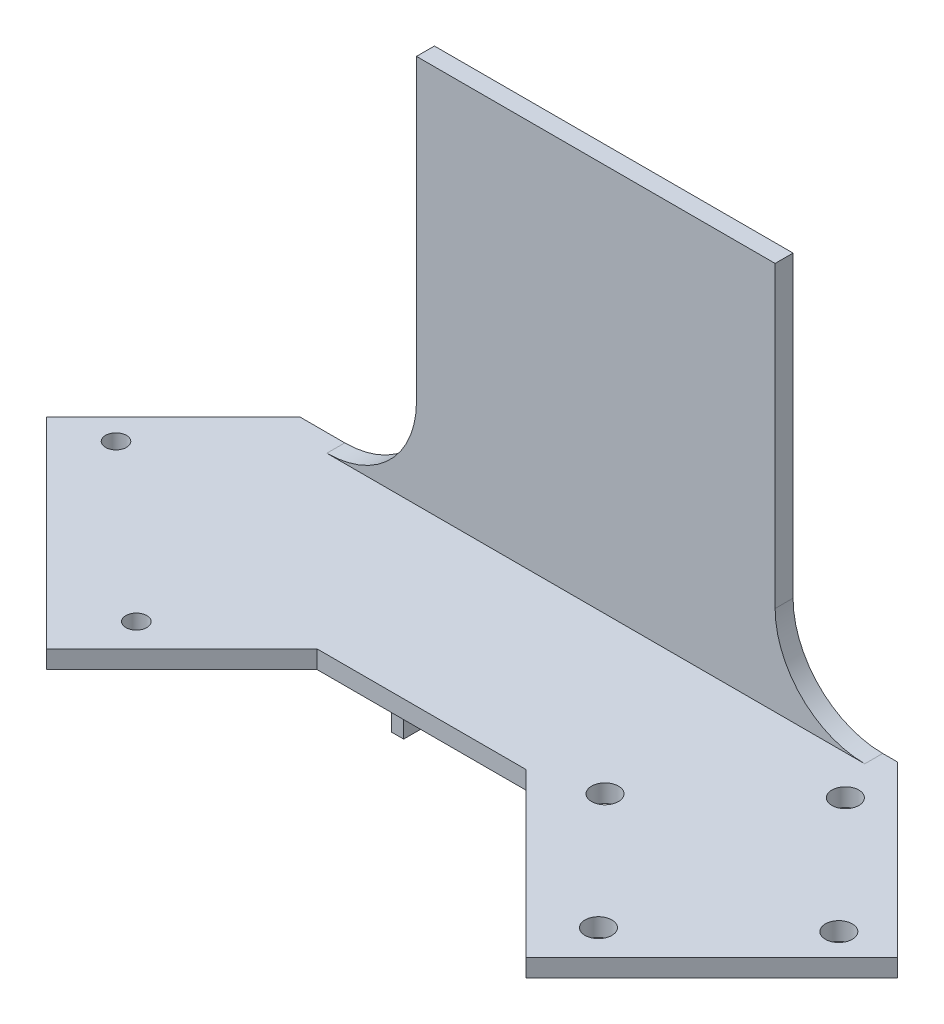
ISO-10303-21;
HEADER;
FILE_DESCRIPTION(('STEP AP214'),'2;1');
FILE_NAME('part.step','',(''),(''),'','','');
FILE_SCHEMA(('AUTOMOTIVE_DESIGN { 1 0 10303 214 1 1 1 1 }'));
ENDSEC;
DATA;
#1=APPLICATION_CONTEXT('core data for automotive mechanical design processes');
#2=APPLICATION_PROTOCOL_DEFINITION('international standard','automotive_design',2000,#1);
#3=PRODUCT_CONTEXT('',#1,'mechanical');
#4=PRODUCT('Part','Part','',(#3));
#5=PRODUCT_RELATED_PRODUCT_CATEGORY('part','',(#4));
#6=PRODUCT_DEFINITION_FORMATION('','',#4);
#7=PRODUCT_DEFINITION_CONTEXT('part definition',#1,'design');
#8=PRODUCT_DEFINITION('design','',#6,#7);
#9=PRODUCT_DEFINITION_SHAPE('','',#8);
#10=(LENGTH_UNIT() NAMED_UNIT(*) SI_UNIT(.MILLI.,.METRE.));
#11=(NAMED_UNIT(*) PLANE_ANGLE_UNIT() SI_UNIT($,.RADIAN.));
#12=(NAMED_UNIT(*) SI_UNIT($,.STERADIAN.) SOLID_ANGLE_UNIT());
#13=UNCERTAINTY_MEASURE_WITH_UNIT(LENGTH_MEASURE(1.E-05),#10,'distance_accuracy_value','');
#14=(GEOMETRIC_REPRESENTATION_CONTEXT(3) GLOBAL_UNCERTAINTY_ASSIGNED_CONTEXT((#13)) GLOBAL_UNIT_ASSIGNED_CONTEXT((#10,
#11,#12)) REPRESENTATION_CONTEXT('',''));
#15=CARTESIAN_POINT('',(0.,0.,0.));
#16=DIRECTION('',(0.,0.,1.));
#17=DIRECTION('',(1.,0.,0.));
#18=AXIS2_PLACEMENT_3D('',#15,#16,#17);
#19=CARTESIAN_POINT('',(0.,23.,0.));
#20=DIRECTION('',(0.,-1.,0.));
#21=DIRECTION('',(0.,0.,-1.));
#22=AXIS2_PLACEMENT_3D('',#19,#20,#21);
#23=PLANE('',#22);
#24=CARTESIAN_POINT('',(30.1205710100305,23.,28.0810825012094));
#25=DIRECTION('',(0.,1.,0.));
#26=DIRECTION('',(0.,0.,-1.));
#27=AXIS2_PLACEMENT_3D('',#24,#25,#26);
#28=CIRCLE('',#27,2.25);
#29=CARTESIAN_POINT('',(30.1205710100305,23.,25.8310825012094));
#30=VERTEX_POINT('',#29);
#31=EDGE_CURVE('E227',#30,#30,#28,.T.);
#32=ORIENTED_EDGE('',*,*,#31,.F.);
#33=EDGE_LOOP('',(#32));
#34=FACE_BOUND('',#33,.T.);
#35=CARTESIAN_POINT('',(50.7964583263744,23.,8.54147176604249));
#36=DIRECTION('',(0.,1.,0.));
#37=DIRECTION('',(0.,0.,1.));
#38=AXIS2_PLACEMENT_3D('',#35,#36,#37);
#39=CIRCLE('',#38,2.25000000000001);
#40=CARTESIAN_POINT('',(50.7964583263744,23.,10.7914717660425));
#41=VERTEX_POINT('',#40);
#42=EDGE_CURVE('E234',#41,#41,#39,.T.);
#43=ORIENTED_EDGE('',*,*,#42,.F.);
#44=EDGE_LOOP('',(#43));
#45=FACE_BOUND('',#44,.T.);
#46=CARTESIAN_POINT('',(69.6382258209996,23.,28.4789345353741));
#47=DIRECTION('',(0.,1.,0.));
#48=DIRECTION('',(0.,0.,-1.));
#49=AXIS2_PLACEMENT_3D('',#46,#47,#48);
#50=CIRCLE('',#49,2.25);
#51=CARTESIAN_POINT('',(69.6382258209996,23.,26.2289345353741));
#52=VERTEX_POINT('',#51);
#53=EDGE_CURVE('E240',#52,#52,#50,.T.);
#54=ORIENTED_EDGE('',*,*,#53,.F.);
#55=EDGE_LOOP('',(#54));
#56=FACE_BOUND('',#55,.T.);
#57=CARTESIAN_POINT('',(48.9623385046557,23.,48.018545270541));
#58=DIRECTION('',(0.,1.,0.));
#59=DIRECTION('',(0.,0.,1.));
#60=AXIS2_PLACEMENT_3D('',#57,#58,#59);
#61=CIRCLE('',#60,2.25);
#62=CARTESIAN_POINT('',(48.9623385046557,23.,50.268545270541));
#63=VERTEX_POINT('',#62);
#64=EDGE_CURVE('E246',#63,#63,#61,.T.);
#65=ORIENTED_EDGE('',*,*,#64,.F.);
#66=EDGE_LOOP('',(#65));
#67=FACE_BOUND('',#66,.T.);
#68=CARTESIAN_POINT('',(-34.0425326872541,23.,42.3289306231757));
#69=DIRECTION('',(0.,1.,0.));
#70=DIRECTION('',(0.,0.,1.));
#71=AXIS2_PLACEMENT_3D('',#68,#69,#70);
#72=CIRCLE('',#71,1.75);
#73=CARTESIAN_POINT('',(-34.0425326872541,23.,44.0789306231757));
#74=VERTEX_POINT('',#73);
#75=EDGE_CURVE('E252',#74,#74,#72,.T.);
#76=ORIENTED_EDGE('',*,*,#75,.F.);
#77=EDGE_LOOP('',(#76));
#78=FACE_BOUND('',#77,.T.);
#79=CARTESIAN_POINT('',(-61.8501462805501,23.,17.9212140924156));
#80=DIRECTION('',(0.,1.,0.));
#81=DIRECTION('',(0.,0.,1.));
#82=AXIS2_PLACEMENT_3D('',#79,#80,#81);
#83=CIRCLE('',#82,1.75);
#84=CARTESIAN_POINT('',(-61.8501462805501,23.,19.6712140924156));
#85=VERTEX_POINT('',#84);
#86=EDGE_CURVE('E258',#85,#85,#83,.T.);
#87=ORIENTED_EDGE('',*,*,#86,.F.);
#88=EDGE_LOOP('',(#87));
#89=FACE_BOUND('',#88,.T.);
#90=DIRECTION('',(-1.,0.,0.));
#91=VECTOR('',#90,1.);
#92=CARTESIAN_POINT('',(-50.,23.,-1.));
#93=LINE('',#92,#91);
#94=CARTESIAN_POINT('',(50.,23.,-1.));
#95=VERTEX_POINT('',#94);
#96=CARTESIAN_POINT('',(47.5,23.,-1.));
#97=VERTEX_POINT('',#96);
#98=EDGE_CURVE('E281',#95,#97,#93,.T.);
#99=ORIENTED_EDGE('',*,*,#98,.T.);
#100=DIRECTION('',(0.,0.,-1.));
#101=VECTOR('',#100,1.);
#102=CARTESIAN_POINT('',(47.5,23.,2.));
#103=LINE('',#102,#101);
#104=CARTESIAN_POINT('',(47.5,23.,2.));
#105=VERTEX_POINT('',#104);
#106=EDGE_CURVE('E399',#97,#105,#103,.F.);
#107=ORIENTED_EDGE('',*,*,#106,.T.);
#108=DIRECTION('',(1.,0.,0.));
#109=VECTOR('',#108,1.);
#110=CARTESIAN_POINT('',(-27.5,23.,2.));
#111=LINE('',#110,#109);
#112=CARTESIAN_POINT('',(-42.5,23.,2.));
#113=VERTEX_POINT('',#112);
#114=EDGE_CURVE('E212',#113,#105,#111,.T.);
#115=ORIENTED_EDGE('',*,*,#114,.F.);
#116=DIRECTION('',(0.,0.,1.));
#117=VECTOR('',#116,1.);
#118=CARTESIAN_POINT('',(-42.5,23.,-1.));
#119=LINE('',#118,#117);
#120=CARTESIAN_POINT('',(-42.5,23.,-1.));
#121=VERTEX_POINT('',#120);
#122=EDGE_CURVE('E397',#113,#121,#119,.F.);
#123=ORIENTED_EDGE('',*,*,#122,.T.);
#124=CARTESIAN_POINT('',(-50.,23.,-1.));
#125=VERTEX_POINT('',#124);
#126=EDGE_CURVE('E280',#121,#125,#93,.T.);
#127=ORIENTED_EDGE('',*,*,#126,.T.);
#128=DIRECTION('',(-0.707106781186547,0.,0.707106781186548));
#129=VECTOR('',#128,1.);
#130=CARTESIAN_POINT('',(-71.2132034355964,23.,20.2132034355964));
#131=LINE('',#130,#129);
#132=CARTESIAN_POINT('',(-71.2132034355964,23.,20.2132034355964));
#133=VERTEX_POINT('',#132);
#134=EDGE_CURVE('E264',#125,#133,#131,.T.);
#135=ORIENTED_EDGE('',*,*,#134,.T.);
#136=DIRECTION('',(0.707106781186548,0.,0.707106781186547));
#137=VECTOR('',#136,1.);
#138=CARTESIAN_POINT('',(-71.2132034355964,23.,20.2132034355964));
#139=LINE('',#138,#137);
#140=CARTESIAN_POINT('',(-37.631017487056,23.,53.7953893841368));
#141=VERTEX_POINT('',#140);
#142=EDGE_CURVE('E267',#133,#141,#139,.T.);
#143=ORIENTED_EDGE('',*,*,#142,.T.);
#144=DIRECTION('',(0.707106781186548,0.,-0.707106781186547));
#145=VECTOR('',#144,1.);
#146=CARTESIAN_POINT('',(-15.,23.,31.1643718970809));
#147=LINE('',#146,#145);
#148=CARTESIAN_POINT('',(-15.,23.,31.1643718970809));
#149=VERTEX_POINT('',#148);
#150=EDGE_CURVE('E270',#141,#149,#147,.T.);
#151=ORIENTED_EDGE('',*,*,#150,.T.);
#152=DIRECTION('',(1.,0.,0.));
#153=VECTOR('',#152,1.);
#154=CARTESIAN_POINT('',(20.,23.,31.1643718970809));
#155=LINE('',#154,#153);
#156=CARTESIAN_POINT('',(20.,23.,31.1643718970809));
#157=VERTEX_POINT('',#156);
#158=EDGE_CURVE('E272',#149,#157,#155,.T.);
#159=ORIENTED_EDGE('',*,*,#158,.T.);
#160=DIRECTION('',(0.707106781186546,0.,0.707106781186549));
#161=VECTOR('',#160,1.);
#162=CARTESIAN_POINT('',(47.2020852989213,23.,58.3664571960023));
#163=LINE('',#162,#161);
#164=CARTESIAN_POINT('',(47.2020852989213,23.,58.3664571960023));
#165=VERTEX_POINT('',#164);
#166=EDGE_CURVE('E274',#157,#165,#163,.T.);
#167=ORIENTED_EDGE('',*,*,#166,.T.);
#168=DIRECTION('',(0.707106781186549,0.,-0.707106781186546));
#169=VECTOR('',#168,1.);
#170=CARTESIAN_POINT('',(78.2842712474619,23.,27.2842712474619));
#171=LINE('',#170,#169);
#172=CARTESIAN_POINT('',(78.2842712474619,23.,27.2842712474619));
#173=VERTEX_POINT('',#172);
#174=EDGE_CURVE('E276',#165,#173,#171,.T.);
#175=ORIENTED_EDGE('',*,*,#174,.T.);
#176=DIRECTION('',(-0.707106781186548,0.,-0.707106781186547));
#177=VECTOR('',#176,1.);
#178=CARTESIAN_POINT('',(50.,23.,-1.));
#179=LINE('',#178,#177);
#180=EDGE_CURVE('E278',#173,#95,#179,.T.);
#181=ORIENTED_EDGE('',*,*,#180,.T.);
#182=EDGE_LOOP('',(#99,#107,#115,#123,#127,#135,#143,#151,#159,#167,#175,#181));
#183=FACE_BOUND('',#182,.T.);
#184=ADVANCED_FACE('F33',(#34,#45,#56,#67,#78,#89,#183),#23,.F.);
#185=CARTESIAN_POINT('',(-19.65,20.,-1.));
#186=DIRECTION('',(0.,0.,1.));
#187=DIRECTION('',(1.,0.,0.));
#188=AXIS2_PLACEMENT_3D('',#185,#186,#187);
#189=PLANE('',#188);
#190=DIRECTION('',(-1.,0.,0.));
#191=VECTOR('',#190,1.);
#192=CARTESIAN_POINT('',(-19.65,0.,-1.));
#193=LINE('',#192,#191);
#194=CARTESIAN_POINT('',(19.65,0.,-1.));
#195=VERTEX_POINT('',#194);
#196=CARTESIAN_POINT('',(-19.65,0.,-1.));
#197=VERTEX_POINT('',#196);
#198=EDGE_CURVE('E325',#195,#197,#193,.T.);
#199=ORIENTED_EDGE('',*,*,#198,.T.);
#200=DIRECTION('',(0.,-1.,0.));
#201=VECTOR('',#200,1.);
#202=CARTESIAN_POINT('',(-19.65,20.,-1.));
#203=LINE('',#202,#201);
#204=CARTESIAN_POINT('',(-19.65,20.,-1.));
#205=VERTEX_POINT('',#204);
#206=EDGE_CURVE('E370',#205,#197,#203,.T.);
#207=ORIENTED_EDGE('',*,*,#206,.F.);
#208=DIRECTION('',(-1.,0.,0.));
#209=VECTOR('',#208,1.);
#210=CARTESIAN_POINT('',(-50.,20.,-1.));
#211=LINE('',#210,#209);
#212=CARTESIAN_POINT('',(-50.,20.,-1.));
#213=VERTEX_POINT('',#212);
#214=EDGE_CURVE('E299',#205,#213,#211,.T.);
#215=ORIENTED_EDGE('',*,*,#214,.T.);
#216=DIRECTION('',(0.,-1.,0.));
#217=VECTOR('',#216,1.);
#218=CARTESIAN_POINT('',(-50.,23.,-1.));
#219=LINE('',#218,#217);
#220=EDGE_CURVE('E284',#125,#213,#219,.T.);
#221=ORIENTED_EDGE('',*,*,#220,.F.);
#222=ORIENTED_EDGE('',*,*,#126,.F.);
#223=CARTESIAN_POINT('',(-42.5,38.,-1.));
#224=DIRECTION('',(0.,0.,1.));
#225=DIRECTION('',(1.,0.,0.));
#226=AXIS2_PLACEMENT_3D('',#223,#224,#225);
#227=CIRCLE('',#226,15.);
#228=CARTESIAN_POINT('',(-27.5,38.,-1.));
#229=VERTEX_POINT('',#228);
#230=EDGE_CURVE('E11',#121,#229,#227,.T.);
#231=ORIENTED_EDGE('',*,*,#230,.T.);
#232=DIRECTION('',(0.,-1.,0.));
#233=VECTOR('',#232,1.);
#234=CARTESIAN_POINT('',(-27.5,88.,-1.));
#235=LINE('',#234,#233);
#236=CARTESIAN_POINT('',(-27.5,88.,-1.));
#237=VERTEX_POINT('',#236);
#238=EDGE_CURVE('E199',#237,#229,#235,.T.);
#239=ORIENTED_EDGE('',*,*,#238,.F.);
#240=DIRECTION('',(-1.,0.,0.));
#241=VECTOR('',#240,1.);
#242=CARTESIAN_POINT('',(-27.5,88.,-1.));
#243=LINE('',#242,#241);
#244=CARTESIAN_POINT('',(32.5,88.,-1.));
#245=VERTEX_POINT('',#244);
#246=EDGE_CURVE('E193',#245,#237,#243,.T.);
#247=ORIENTED_EDGE('',*,*,#246,.F.);
#248=DIRECTION('',(0.,-1.,0.));
#249=VECTOR('',#248,1.);
#250=CARTESIAN_POINT('',(32.5,88.,-1.));
#251=LINE('',#250,#249);
#252=CARTESIAN_POINT('',(32.5,38.,-1.));
#253=VERTEX_POINT('',#252);
#254=EDGE_CURVE('E198',#245,#253,#251,.T.);
#255=ORIENTED_EDGE('',*,*,#254,.T.);
#256=CARTESIAN_POINT('',(47.5,38.,-1.));
#257=DIRECTION('',(0.,0.,1.));
#258=DIRECTION('',(1.,0.,0.));
#259=AXIS2_PLACEMENT_3D('',#256,#257,#258);
#260=CIRCLE('',#259,15.);
#261=EDGE_CURVE('E404',#253,#97,#260,.T.);
#262=ORIENTED_EDGE('',*,*,#261,.T.);
#263=ORIENTED_EDGE('',*,*,#98,.F.);
#264=DIRECTION('',(0.,-1.,0.));
#265=VECTOR('',#264,1.);
#266=CARTESIAN_POINT('',(50.,23.,-1.));
#267=LINE('',#266,#265);
#268=CARTESIAN_POINT('',(50.,20.,-1.));
#269=VERTEX_POINT('',#268);
#270=EDGE_CURVE('E304',#95,#269,#267,.T.);
#271=ORIENTED_EDGE('',*,*,#270,.T.);
#272=CARTESIAN_POINT('',(19.65,20.,-1.));
#273=VERTEX_POINT('',#272);
#274=EDGE_CURVE('E268',#269,#273,#211,.T.);
#275=ORIENTED_EDGE('',*,*,#274,.T.);
#276=DIRECTION('',(0.,-1.,0.));
#277=VECTOR('',#276,1.);
#278=CARTESIAN_POINT('',(19.65,20.,-1.));
#279=LINE('',#278,#277);
#280=EDGE_CURVE('E373',#273,#195,#279,.T.);
#281=ORIENTED_EDGE('',*,*,#280,.T.);
#282=EDGE_LOOP('',(#199,#207,#215,#221,#222,#231,#239,#247,#255,#262,#263,#271,#275,#281));
#283=FACE_BOUND('',#282,.T.);
#284=ADVANCED_FACE('F196',(#283),#189,.F.);
#285=CARTESIAN_POINT('',(-19.65,20.,1.));
#286=DIRECTION('',(1.,0.,0.));
#287=DIRECTION('',(0.,0.,-1.));
#288=AXIS2_PLACEMENT_3D('',#285,#286,#287);
#289=PLANE('',#288);
#290=DIRECTION('',(0.,0.,1.));
#291=VECTOR('',#290,1.);
#292=CARTESIAN_POINT('',(-19.65,0.,1.));
#293=LINE('',#292,#291);
#294=CARTESIAN_POINT('',(-19.65,0.,14.));
#295=VERTEX_POINT('',#294);
#296=EDGE_CURVE('E340',#197,#295,#293,.T.);
#297=ORIENTED_EDGE('',*,*,#296,.T.);
#298=DIRECTION('',(0.,-1.,0.));
#299=VECTOR('',#298,1.);
#300=CARTESIAN_POINT('',(-19.65,20.,14.));
#301=LINE('',#300,#299);
#302=CARTESIAN_POINT('',(-19.65,20.,14.));
#303=VERTEX_POINT('',#302);
#304=EDGE_CURVE('E367',#303,#295,#301,.T.);
#305=ORIENTED_EDGE('',*,*,#304,.F.);
#306=DIRECTION('',(0.,0.,1.));
#307=VECTOR('',#306,1.);
#308=CARTESIAN_POINT('',(-19.65,20.,1.));
#309=LINE('',#308,#307);
#310=EDGE_CURVE('E329',#205,#303,#309,.T.);
#311=ORIENTED_EDGE('',*,*,#310,.F.);
#312=ORIENTED_EDGE('',*,*,#206,.T.);
#313=EDGE_LOOP('',(#297,#305,#311,#312));
#314=FACE_BOUND('',#313,.T.);
#315=ADVANCED_FACE('F476',(#314),#289,.F.);
#316=CARTESIAN_POINT('',(-19.65,20.,14.));
#317=DIRECTION('',(0.,0.,-1.));
#318=DIRECTION('',(-1.,0.,0.));
#319=AXIS2_PLACEMENT_3D('',#316,#317,#318);
#320=PLANE('',#319);
#321=DIRECTION('',(1.,0.,0.));
#322=VECTOR('',#321,1.);
#323=CARTESIAN_POINT('',(-19.65,0.,14.));
#324=LINE('',#323,#322);
#325=CARTESIAN_POINT('',(-17.65,0.,14.));
#326=VERTEX_POINT('',#325);
#327=EDGE_CURVE('E342',#295,#326,#324,.T.);
#328=ORIENTED_EDGE('',*,*,#327,.T.);
#329=DIRECTION('',(0.,-1.,0.));
#330=VECTOR('',#329,1.);
#331=CARTESIAN_POINT('',(-17.65,20.,14.));
#332=LINE('',#331,#330);
#333=CARTESIAN_POINT('',(-17.65,12.,14.));
#334=VERTEX_POINT('',#333);
#335=EDGE_CURVE('E365',#334,#326,#332,.T.);
#336=ORIENTED_EDGE('',*,*,#335,.F.);
#337=CARTESIAN_POINT('',(-9.65,12.,14.));
#338=DIRECTION('',(0.,0.,-1.));
#339=DIRECTION('',(-1.,0.,0.));
#340=AXIS2_PLACEMENT_3D('',#337,#338,#339);
#341=CIRCLE('',#340,8.);
#342=CARTESIAN_POINT('',(-9.65,20.,14.));
#343=VERTEX_POINT('',#342);
#344=EDGE_CURVE('E391',#334,#343,#341,.T.);
#345=ORIENTED_EDGE('',*,*,#344,.T.);
#346=DIRECTION('',(1.,0.,0.));
#347=VECTOR('',#346,1.);
#348=CARTESIAN_POINT('',(-19.65,20.,14.));
#349=LINE('',#348,#347);
#350=EDGE_CURVE('E333',#303,#343,#349,.T.);
#351=ORIENTED_EDGE('',*,*,#350,.F.);
#352=ORIENTED_EDGE('',*,*,#304,.T.);
#353=EDGE_LOOP('',(#328,#336,#345,#351,#352));
#354=FACE_BOUND('',#353,.T.);
#355=ADVANCED_FACE('F525',(#354),#320,.F.);
#356=CARTESIAN_POINT('',(-17.65,20.,1.));
#357=DIRECTION('',(-1.,0.,0.));
#358=DIRECTION('',(0.,0.,1.));
#359=AXIS2_PLACEMENT_3D('',#356,#357,#358);
#360=PLANE('',#359);
#361=DIRECTION('',(0.,-1.,0.));
#362=VECTOR('',#361,1.);
#363=CARTESIAN_POINT('',(-17.65,20.,1.));
#364=LINE('',#363,#362);
#365=CARTESIAN_POINT('',(-17.65,12.,1.));
#366=VERTEX_POINT('',#365);
#367=CARTESIAN_POINT('',(-17.65,0.,1.));
#368=VERTEX_POINT('',#367);
#369=EDGE_CURVE('E363',#366,#368,#364,.T.);
#370=ORIENTED_EDGE('',*,*,#369,.F.);
#371=DIRECTION('',(0.,0.,-1.));
#372=VECTOR('',#371,1.);
#373=CARTESIAN_POINT('',(-17.65,12.,1.));
#374=LINE('',#373,#372);
#375=EDGE_CURVE('E387',#366,#334,#374,.F.);
#376=ORIENTED_EDGE('',*,*,#375,.T.);
#377=ORIENTED_EDGE('',*,*,#335,.T.);
#378=DIRECTION('',(0.,0.,-1.));
#379=VECTOR('',#378,1.);
#380=CARTESIAN_POINT('',(-17.65,0.,1.));
#381=LINE('',#380,#379);
#382=EDGE_CURVE('E345',#326,#368,#381,.T.);
#383=ORIENTED_EDGE('',*,*,#382,.T.);
#384=EDGE_LOOP('',(#370,#376,#377,#383));
#385=FACE_BOUND('',#384,.T.);
#386=ADVANCED_FACE('F521',(#385),#360,.F.);
#387=CARTESIAN_POINT('',(-17.65,20.,1.));
#388=DIRECTION('',(0.,0.,-1.));
#389=DIRECTION('',(-1.,0.,0.));
#390=AXIS2_PLACEMENT_3D('',#387,#388,#389);
#391=PLANE('',#390);
#392=DIRECTION('',(0.,-1.,0.));
#393=VECTOR('',#392,1.);
#394=CARTESIAN_POINT('',(17.65,20.,1.));
#395=LINE('',#394,#393);
#396=CARTESIAN_POINT('',(17.65,12.,1.));
#397=VERTEX_POINT('',#396);
#398=CARTESIAN_POINT('',(17.65,0.,1.));
#399=VERTEX_POINT('',#398);
#400=EDGE_CURVE('E361',#397,#399,#395,.T.);
#401=ORIENTED_EDGE('',*,*,#400,.F.);
#402=DIRECTION('',(1.,0.,0.));
#403=VECTOR('',#402,1.);
#404=CARTESIAN_POINT('',(-17.65,12.,1.));
#405=LINE('',#404,#403);
#406=EDGE_CURVE('E385',#397,#366,#405,.F.);
#407=ORIENTED_EDGE('',*,*,#406,.T.);
#408=ORIENTED_EDGE('',*,*,#369,.T.);
#409=DIRECTION('',(1.,0.,0.));
#410=VECTOR('',#409,1.);
#411=CARTESIAN_POINT('',(-17.65,0.,1.));
#412=LINE('',#411,#410);
#413=EDGE_CURVE('E348',#368,#399,#412,.T.);
#414=ORIENTED_EDGE('',*,*,#413,.T.);
#415=EDGE_LOOP('',(#401,#407,#408,#414));
#416=FACE_BOUND('',#415,.T.);
#417=ADVANCED_FACE('F517',(#416),#391,.F.);
#418=CARTESIAN_POINT('',(17.65,20.,1.));
#419=DIRECTION('',(1.,0.,0.));
#420=DIRECTION('',(0.,0.,-1.));
#421=AXIS2_PLACEMENT_3D('',#418,#419,#420);
#422=PLANE('',#421);
#423=DIRECTION('',(0.,-1.,0.));
#424=VECTOR('',#423,1.);
#425=CARTESIAN_POINT('',(17.65,20.,14.));
#426=LINE('',#425,#424);
#427=CARTESIAN_POINT('',(17.65,12.,14.));
#428=VERTEX_POINT('',#427);
#429=CARTESIAN_POINT('',(17.65,0.,14.));
#430=VERTEX_POINT('',#429);
#431=EDGE_CURVE('E359',#428,#430,#426,.T.);
#432=ORIENTED_EDGE('',*,*,#431,.F.);
#433=DIRECTION('',(0.,0.,1.));
#434=VECTOR('',#433,1.);
#435=CARTESIAN_POINT('',(17.65,12.,1.));
#436=LINE('',#435,#434);
#437=EDGE_CURVE('E383',#428,#397,#436,.F.);
#438=ORIENTED_EDGE('',*,*,#437,.T.);
#439=ORIENTED_EDGE('',*,*,#400,.T.);
#440=DIRECTION('',(0.,0.,1.));
#441=VECTOR('',#440,1.);
#442=CARTESIAN_POINT('',(17.65,0.,1.));
#443=LINE('',#442,#441);
#444=EDGE_CURVE('E351',#399,#430,#443,.T.);
#445=ORIENTED_EDGE('',*,*,#444,.T.);
#446=EDGE_LOOP('',(#432,#438,#439,#445));
#447=FACE_BOUND('',#446,.T.);
#448=ADVANCED_FACE('F513',(#447),#422,.F.);
#449=CARTESIAN_POINT('',(19.65,20.,14.));
#450=DIRECTION('',(0.,0.,-1.));
#451=DIRECTION('',(-1.,0.,0.));
#452=AXIS2_PLACEMENT_3D('',#449,#450,#451);
#453=PLANE('',#452);
#454=DIRECTION('',(1.,0.,0.));
#455=VECTOR('',#454,1.);
#456=CARTESIAN_POINT('',(19.65,0.,14.));
#457=LINE('',#456,#455);
#458=CARTESIAN_POINT('',(19.65,0.,14.));
#459=VERTEX_POINT('',#458);
#460=EDGE_CURVE('E354',#430,#459,#457,.T.);
#461=ORIENTED_EDGE('',*,*,#460,.T.);
#462=DIRECTION('',(0.,-1.,0.));
#463=VECTOR('',#462,1.);
#464=CARTESIAN_POINT('',(19.65,20.,14.));
#465=LINE('',#464,#463);
#466=CARTESIAN_POINT('',(19.65,20.,14.));
#467=VERTEX_POINT('',#466);
#468=EDGE_CURVE('E338',#467,#459,#465,.T.);
#469=ORIENTED_EDGE('',*,*,#468,.F.);
#470=DIRECTION('',(1.,0.,0.));
#471=VECTOR('',#470,1.);
#472=CARTESIAN_POINT('',(19.65,20.,14.));
#473=LINE('',#472,#471);
#474=CARTESIAN_POINT('',(9.65,20.,14.));
#475=VERTEX_POINT('',#474);
#476=EDGE_CURVE('E335',#475,#467,#473,.T.);
#477=ORIENTED_EDGE('',*,*,#476,.F.);
#478=CARTESIAN_POINT('',(9.65,12.,14.));
#479=DIRECTION('',(0.,0.,-1.));
#480=DIRECTION('',(-1.,0.,0.));
#481=AXIS2_PLACEMENT_3D('',#478,#479,#480);
#482=CIRCLE('',#481,8.);
#483=EDGE_CURVE('E389',#475,#428,#482,.T.);
#484=ORIENTED_EDGE('',*,*,#483,.T.);
#485=ORIENTED_EDGE('',*,*,#431,.T.);
#486=EDGE_LOOP('',(#461,#469,#477,#484,#485));
#487=FACE_BOUND('',#486,.T.);
#488=ADVANCED_FACE('F509',(#487),#453,.F.);
#489=CARTESIAN_POINT('',(19.65,20.,1.));
#490=DIRECTION('',(-1.,0.,0.));
#491=DIRECTION('',(0.,0.,1.));
#492=AXIS2_PLACEMENT_3D('',#489,#490,#491);
#493=PLANE('',#492);
#494=DIRECTION('',(0.,0.,-1.));
#495=VECTOR('',#494,1.);
#496=CARTESIAN_POINT('',(19.65,0.,1.));
#497=LINE('',#496,#495);
#498=EDGE_CURVE('E330',#459,#195,#497,.T.);
#499=ORIENTED_EDGE('',*,*,#498,.T.);
#500=ORIENTED_EDGE('',*,*,#280,.F.);
#501=DIRECTION('',(0.,0.,-1.));
#502=VECTOR('',#501,1.);
#503=CARTESIAN_POINT('',(19.65,20.,1.));
#504=LINE('',#503,#502);
#505=EDGE_CURVE('E326',#467,#273,#504,.T.);
#506=ORIENTED_EDGE('',*,*,#505,.F.);
#507=ORIENTED_EDGE('',*,*,#468,.T.);
#508=EDGE_LOOP('',(#499,#500,#506,#507));
#509=FACE_BOUND('',#508,.T.);
#510=ADVANCED_FACE('F505',(#509),#493,.F.);
#511=CARTESIAN_POINT('',(0.,0.,0.));
#512=DIRECTION('',(0.,-1.,0.));
#513=DIRECTION('',(0.,0.,-1.));
#514=AXIS2_PLACEMENT_3D('',#511,#512,#513);
#515=PLANE('',#514);
#516=ORIENTED_EDGE('',*,*,#198,.F.);
#517=ORIENTED_EDGE('',*,*,#498,.F.);
#518=ORIENTED_EDGE('',*,*,#460,.F.);
#519=ORIENTED_EDGE('',*,*,#444,.F.);
#520=ORIENTED_EDGE('',*,*,#413,.F.);
#521=ORIENTED_EDGE('',*,*,#382,.F.);
#522=ORIENTED_EDGE('',*,*,#327,.F.);
#523=ORIENTED_EDGE('',*,*,#296,.F.);
#524=EDGE_LOOP('',(#516,#517,#518,#519,#520,#521,#522,#523));
#525=FACE_BOUND('',#524,.T.);
#526=ADVANCED_FACE('F487',(#525),#515,.T.);
#527=CARTESIAN_POINT('',(0.,20.,0.));
#528=DIRECTION('',(0.,-1.,0.));
#529=DIRECTION('',(0.,0.,-1.));
#530=AXIS2_PLACEMENT_3D('',#527,#528,#529);
#531=PLANE('',#530);
#532=CARTESIAN_POINT('',(50.7964583263744,20.,8.54147176604249));
#533=DIRECTION('',(0.,1.,0.));
#534=DIRECTION('',(0.,0.,1.));
#535=AXIS2_PLACEMENT_3D('',#532,#533,#534);
#536=CIRCLE('',#535,2.25000000000001);
#537=CARTESIAN_POINT('',(50.7964583263744,20.,10.7914717660425));
#538=VERTEX_POINT('',#537);
#539=EDGE_CURVE('E230',#538,#538,#536,.T.);
#540=ORIENTED_EDGE('',*,*,#539,.T.);
#541=EDGE_LOOP('',(#540));
#542=FACE_BOUND('',#541,.T.);
#543=CARTESIAN_POINT('',(48.9623385046557,20.,48.018545270541));
#544=DIRECTION('',(0.,1.,0.));
#545=DIRECTION('',(0.,0.,1.));
#546=AXIS2_PLACEMENT_3D('',#543,#544,#545);
#547=CIRCLE('',#546,2.25);
#548=CARTESIAN_POINT('',(48.9623385046557,20.,50.268545270541));
#549=VERTEX_POINT('',#548);
#550=EDGE_CURVE('E243',#549,#549,#547,.T.);
#551=ORIENTED_EDGE('',*,*,#550,.T.);
#552=EDGE_LOOP('',(#551));
#553=FACE_BOUND('',#552,.T.);
#554=CARTESIAN_POINT('',(-61.8501462805501,20.,17.9212140924156));
#555=DIRECTION('',(0.,1.,0.));
#556=DIRECTION('',(0.,0.,1.));
#557=AXIS2_PLACEMENT_3D('',#554,#555,#556);
#558=CIRCLE('',#557,1.75);
#559=CARTESIAN_POINT('',(-61.8501462805501,20.,19.6712140924156));
#560=VERTEX_POINT('',#559);
#561=EDGE_CURVE('E255',#560,#560,#558,.T.);
#562=ORIENTED_EDGE('',*,*,#561,.T.);
#563=EDGE_LOOP('',(#562));
#564=FACE_BOUND('',#563,.T.);
#565=DIRECTION('',(0.,0.,1.));
#566=VECTOR('',#565,1.);
#567=CARTESIAN_POINT('',(9.65,20.,0.));
#568=LINE('',#567,#566);
#569=CARTESIAN_POINT('',(9.65,20.,9.));
#570=VERTEX_POINT('',#569);
#571=EDGE_CURVE('E380',#570,#475,#568,.T.);
#572=ORIENTED_EDGE('',*,*,#571,.T.);
#573=ORIENTED_EDGE('',*,*,#476,.T.);
#574=ORIENTED_EDGE('',*,*,#505,.T.);
#575=ORIENTED_EDGE('',*,*,#274,.F.);
#576=DIRECTION('',(-0.707106781186548,0.,-0.707106781186547));
#577=VECTOR('',#576,1.);
#578=CARTESIAN_POINT('',(50.,20.,-1.));
#579=LINE('',#578,#577);
#580=CARTESIAN_POINT('',(78.2842712474619,20.,27.2842712474619));
#581=VERTEX_POINT('',#580);
#582=EDGE_CURVE('E297',#581,#269,#579,.T.);
#583=ORIENTED_EDGE('',*,*,#582,.F.);
#584=DIRECTION('',(0.707106781186549,0.,-0.707106781186546));
#585=VECTOR('',#584,1.);
#586=CARTESIAN_POINT('',(78.2842712474619,20.,27.2842712474619));
#587=LINE('',#586,#585);
#588=CARTESIAN_POINT('',(47.2020852989213,20.,58.3664571960023));
#589=VERTEX_POINT('',#588);
#590=EDGE_CURVE('E295',#589,#581,#587,.T.);
#591=ORIENTED_EDGE('',*,*,#590,.F.);
#592=DIRECTION('',(0.707106781186546,0.,0.707106781186549));
#593=VECTOR('',#592,1.);
#594=CARTESIAN_POINT('',(47.2020852989213,20.,58.3664571960023));
#595=LINE('',#594,#593);
#596=CARTESIAN_POINT('',(20.,20.,31.1643718970809));
#597=VERTEX_POINT('',#596);
#598=EDGE_CURVE('E293',#597,#589,#595,.T.);
#599=ORIENTED_EDGE('',*,*,#598,.F.);
#600=DIRECTION('',(1.,0.,0.));
#601=VECTOR('',#600,1.);
#602=CARTESIAN_POINT('',(20.,20.,31.1643718970809));
#603=LINE('',#602,#601);
#604=CARTESIAN_POINT('',(-15.,20.,31.1643718970809));
#605=VERTEX_POINT('',#604);
#606=EDGE_CURVE('E291',#605,#597,#603,.T.);
#607=ORIENTED_EDGE('',*,*,#606,.F.);
#608=DIRECTION('',(0.707106781186548,0.,-0.707106781186547));
#609=VECTOR('',#608,1.);
#610=CARTESIAN_POINT('',(-15.,20.,31.1643718970809));
#611=LINE('',#610,#609);
#612=CARTESIAN_POINT('',(-37.631017487056,20.,53.7953893841368));
#613=VERTEX_POINT('',#612);
#614=EDGE_CURVE('E289',#613,#605,#611,.T.);
#615=ORIENTED_EDGE('',*,*,#614,.F.);
#616=DIRECTION('',(0.707106781186548,0.,0.707106781186547));
#617=VECTOR('',#616,1.);
#618=CARTESIAN_POINT('',(-71.2132034355964,20.,20.2132034355964));
#619=LINE('',#618,#617);
#620=CARTESIAN_POINT('',(-71.2132034355964,20.,20.2132034355964));
#621=VERTEX_POINT('',#620);
#622=EDGE_CURVE('E287',#621,#613,#619,.T.);
#623=ORIENTED_EDGE('',*,*,#622,.F.);
#624=DIRECTION('',(-0.707106781186547,0.,0.707106781186548));
#625=VECTOR('',#624,1.);
#626=CARTESIAN_POINT('',(-71.2132034355964,20.,20.2132034355964));
#627=LINE('',#626,#625);
#628=EDGE_CURVE('E261',#213,#621,#627,.T.);
#629=ORIENTED_EDGE('',*,*,#628,.F.);
#630=ORIENTED_EDGE('',*,*,#214,.F.);
#631=ORIENTED_EDGE('',*,*,#310,.T.);
#632=ORIENTED_EDGE('',*,*,#350,.T.);
#633=DIRECTION('',(0.,0.,-1.));
#634=VECTOR('',#633,1.);
#635=CARTESIAN_POINT('',(-9.65,20.,0.));
#636=LINE('',#635,#634);
#637=CARTESIAN_POINT('',(-9.65,20.,9.));
#638=VERTEX_POINT('',#637);
#639=EDGE_CURVE('E376',#343,#638,#636,.T.);
#640=ORIENTED_EDGE('',*,*,#639,.T.);
#641=DIRECTION('',(1.,0.,0.));
#642=VECTOR('',#641,1.);
#643=CARTESIAN_POINT('',(0.,20.,9.));
#644=LINE('',#643,#642);
#645=EDGE_CURVE('E378',#638,#570,#644,.T.);
#646=ORIENTED_EDGE('',*,*,#645,.T.);
#647=EDGE_LOOP('',(#572,#573,#574,#575,#583,#591,#599,#607,#615,#623,#629,#630,#631,#632,#640,#646));
#648=FACE_BOUND('',#647,.T.);
#649=CARTESIAN_POINT('',(-34.0425326872541,20.,42.3289306231757));
#650=DIRECTION('',(0.,1.,0.));
#651=DIRECTION('',(0.,0.,1.));
#652=AXIS2_PLACEMENT_3D('',#649,#650,#651);
#653=CIRCLE('',#652,1.75);
#654=CARTESIAN_POINT('',(-34.0425326872541,20.,44.0789306231757));
#655=VERTEX_POINT('',#654);
#656=EDGE_CURVE('E249',#655,#655,#653,.T.);
#657=ORIENTED_EDGE('',*,*,#656,.T.);
#658=EDGE_LOOP('',(#657));
#659=FACE_BOUND('',#658,.T.);
#660=CARTESIAN_POINT('',(69.6382258209996,20.,28.4789345353741));
#661=DIRECTION('',(0.,1.,0.));
#662=DIRECTION('',(0.,0.,-1.));
#663=AXIS2_PLACEMENT_3D('',#660,#661,#662);
#664=CIRCLE('',#663,2.25);
#665=CARTESIAN_POINT('',(69.6382258209996,20.,26.2289345353741));
#666=VERTEX_POINT('',#665);
#667=EDGE_CURVE('E237',#666,#666,#664,.T.);
#668=ORIENTED_EDGE('',*,*,#667,.T.);
#669=EDGE_LOOP('',(#668));
#670=FACE_BOUND('',#669,.T.);
#671=CARTESIAN_POINT('',(30.1205710100305,20.,28.0810825012094));
#672=DIRECTION('',(0.,1.,0.));
#673=DIRECTION('',(0.,0.,-1.));
#674=AXIS2_PLACEMENT_3D('',#671,#672,#673);
#675=CIRCLE('',#674,2.25);
#676=CARTESIAN_POINT('',(30.1205710100305,20.,25.8310825012094));
#677=VERTEX_POINT('',#676);
#678=EDGE_CURVE('E231',#677,#677,#675,.T.);
#679=ORIENTED_EDGE('',*,*,#678,.T.);
#680=EDGE_LOOP('',(#679));
#681=FACE_BOUND('',#680,.T.);
#682=ADVANCED_FACE('F484',(#542,#553,#564,#648,#659,#670,#681),#531,.T.);
#683=CARTESIAN_POINT('',(-71.2132034355964,23.,20.2132034355964));
#684=DIRECTION('',(0.707106781186548,0.,0.707106781186547));
#685=DIRECTION('',(0.707106781186547,0.,-0.707106781186548));
#686=AXIS2_PLACEMENT_3D('',#683,#684,#685);
#687=PLANE('',#686);
#688=ORIENTED_EDGE('',*,*,#628,.T.);
#689=DIRECTION('',(0.,-1.,0.));
#690=VECTOR('',#689,1.);
#691=CARTESIAN_POINT('',(-71.2132034355964,23.,20.2132034355964));
#692=LINE('',#691,#690);
#693=EDGE_CURVE('E322',#133,#621,#692,.T.);
#694=ORIENTED_EDGE('',*,*,#693,.F.);
#695=ORIENTED_EDGE('',*,*,#134,.F.);
#696=ORIENTED_EDGE('',*,*,#220,.T.);
#697=EDGE_LOOP('',(#688,#694,#695,#696));
#698=FACE_BOUND('',#697,.T.);
#699=ADVANCED_FACE('F418',(#698),#687,.F.);
#700=CARTESIAN_POINT('',(-71.2132034355964,23.,20.2132034355964));
#701=DIRECTION('',(0.707106781186547,0.,-0.707106781186548));
#702=DIRECTION('',(-0.707106781186548,0.,-0.707106781186547));
#703=AXIS2_PLACEMENT_3D('',#700,#701,#702);
#704=PLANE('',#703);
#705=ORIENTED_EDGE('',*,*,#622,.T.);
#706=DIRECTION('',(0.,-1.,0.));
#707=VECTOR('',#706,1.);
#708=CARTESIAN_POINT('',(-37.631017487056,23.,53.7953893841368));
#709=LINE('',#708,#707);
#710=EDGE_CURVE('E319',#141,#613,#709,.T.);
#711=ORIENTED_EDGE('',*,*,#710,.F.);
#712=ORIENTED_EDGE('',*,*,#142,.F.);
#713=ORIENTED_EDGE('',*,*,#693,.T.);
#714=EDGE_LOOP('',(#705,#711,#712,#713));
#715=FACE_BOUND('',#714,.T.);
#716=ADVANCED_FACE('F423',(#715),#704,.F.);
#717=CARTESIAN_POINT('',(-15.,23.,31.1643718970809));
#718=DIRECTION('',(-0.707106781186547,0.,-0.707106781186548));
#719=DIRECTION('',(-0.707106781186548,0.,0.707106781186547));
#720=AXIS2_PLACEMENT_3D('',#717,#718,#719);
#721=PLANE('',#720);
#722=ORIENTED_EDGE('',*,*,#614,.T.);
#723=DIRECTION('',(0.,-1.,0.));
#724=VECTOR('',#723,1.);
#725=CARTESIAN_POINT('',(-15.,23.,31.1643718970809));
#726=LINE('',#725,#724);
#727=EDGE_CURVE('E316',#149,#605,#726,.T.);
#728=ORIENTED_EDGE('',*,*,#727,.F.);
#729=ORIENTED_EDGE('',*,*,#150,.F.);
#730=ORIENTED_EDGE('',*,*,#710,.T.);
#731=EDGE_LOOP('',(#722,#728,#729,#730));
#732=FACE_BOUND('',#731,.T.);
#733=ADVANCED_FACE('F426',(#732),#721,.F.);
#734=CARTESIAN_POINT('',(20.,23.,31.1643718970809));
#735=DIRECTION('',(0.,0.,-1.));
#736=DIRECTION('',(-1.,0.,0.));
#737=AXIS2_PLACEMENT_3D('',#734,#735,#736);
#738=PLANE('',#737);
#739=ORIENTED_EDGE('',*,*,#606,.T.);
#740=DIRECTION('',(0.,-1.,0.));
#741=VECTOR('',#740,1.);
#742=CARTESIAN_POINT('',(20.,23.,31.1643718970809));
#743=LINE('',#742,#741);
#744=EDGE_CURVE('E313',#157,#597,#743,.T.);
#745=ORIENTED_EDGE('',*,*,#744,.F.);
#746=ORIENTED_EDGE('',*,*,#158,.F.);
#747=ORIENTED_EDGE('',*,*,#727,.T.);
#748=EDGE_LOOP('',(#739,#745,#746,#747));
#749=FACE_BOUND('',#748,.T.);
#750=ADVANCED_FACE('F431',(#749),#738,.F.);
#751=CARTESIAN_POINT('',(47.2020852989213,23.,58.3664571960023));
#752=DIRECTION('',(0.707106781186549,0.,-0.707106781186546));
#753=DIRECTION('',(-0.707106781186546,0.,-0.707106781186549));
#754=AXIS2_PLACEMENT_3D('',#751,#752,#753);
#755=PLANE('',#754);
#756=ORIENTED_EDGE('',*,*,#598,.T.);
#757=DIRECTION('',(0.,-1.,0.));
#758=VECTOR('',#757,1.);
#759=CARTESIAN_POINT('',(47.2020852989213,23.,58.3664571960023));
#760=LINE('',#759,#758);
#761=EDGE_CURVE('E310',#165,#589,#760,.T.);
#762=ORIENTED_EDGE('',*,*,#761,.F.);
#763=ORIENTED_EDGE('',*,*,#166,.F.);
#764=ORIENTED_EDGE('',*,*,#744,.T.);
#765=EDGE_LOOP('',(#756,#762,#763,#764));
#766=FACE_BOUND('',#765,.T.);
#767=ADVANCED_FACE('F437',(#766),#755,.F.);
#768=CARTESIAN_POINT('',(78.2842712474619,23.,27.2842712474619));
#769=DIRECTION('',(-0.707106781186546,0.,-0.707106781186549));
#770=DIRECTION('',(-0.707106781186549,0.,0.707106781186546));
#771=AXIS2_PLACEMENT_3D('',#768,#769,#770);
#772=PLANE('',#771);
#773=ORIENTED_EDGE('',*,*,#590,.T.);
#774=DIRECTION('',(0.,-1.,0.));
#775=VECTOR('',#774,1.);
#776=CARTESIAN_POINT('',(78.2842712474619,23.,27.2842712474619));
#777=LINE('',#776,#775);
#778=EDGE_CURVE('E307',#173,#581,#777,.T.);
#779=ORIENTED_EDGE('',*,*,#778,.F.);
#780=ORIENTED_EDGE('',*,*,#174,.F.);
#781=ORIENTED_EDGE('',*,*,#761,.T.);
#782=EDGE_LOOP('',(#773,#779,#780,#781));
#783=FACE_BOUND('',#782,.T.);
#784=ADVANCED_FACE('F441',(#783),#772,.F.);
#785=CARTESIAN_POINT('',(50.,23.,-1.));
#786=DIRECTION('',(-0.707106781186547,0.,0.707106781186548));
#787=DIRECTION('',(0.707106781186548,0.,0.707106781186547));
#788=AXIS2_PLACEMENT_3D('',#785,#786,#787);
#789=PLANE('',#788);
#790=ORIENTED_EDGE('',*,*,#582,.T.);
#791=ORIENTED_EDGE('',*,*,#270,.F.);
#792=ORIENTED_EDGE('',*,*,#180,.F.);
#793=ORIENTED_EDGE('',*,*,#778,.T.);
#794=EDGE_LOOP('',(#790,#791,#792,#793));
#795=FACE_BOUND('',#794,.T.);
#796=ADVANCED_FACE('F446',(#795),#789,.F.);
#797=CARTESIAN_POINT('',(-61.8501462805501,23.,17.9212140924156));
#798=DIRECTION('',(0.,-1.,0.));
#799=DIRECTION('',(0.,0.,-1.));
#800=AXIS2_PLACEMENT_3D('',#797,#798,#799);
#801=CYLINDRICAL_SURFACE('',#800,1.75);
#802=ORIENTED_EDGE('',*,*,#86,.T.);
#803=EDGE_LOOP('',(#802));
#804=FACE_BOUND('',#803,.T.);
#805=ORIENTED_EDGE('',*,*,#561,.F.);
#806=EDGE_LOOP('',(#805));
#807=FACE_BOUND('',#806,.T.);
#808=ADVANCED_FACE('F482',(#804,#807),#801,.F.);
#809=CARTESIAN_POINT('',(-34.0425326872541,23.,42.3289306231757));
#810=DIRECTION('',(0.,-1.,0.));
#811=DIRECTION('',(0.,0.,-1.));
#812=AXIS2_PLACEMENT_3D('',#809,#810,#811);
#813=CYLINDRICAL_SURFACE('',#812,1.75);
#814=ORIENTED_EDGE('',*,*,#75,.T.);
#815=EDGE_LOOP('',(#814));
#816=FACE_BOUND('',#815,.T.);
#817=ORIENTED_EDGE('',*,*,#656,.F.);
#818=EDGE_LOOP('',(#817));
#819=FACE_BOUND('',#818,.T.);
#820=ADVANCED_FACE('F633',(#816,#819),#813,.F.);
#821=CARTESIAN_POINT('',(48.9623385046557,23.,48.018545270541));
#822=DIRECTION('',(0.,-1.,0.));
#823=DIRECTION('',(0.,0.,-1.));
#824=AXIS2_PLACEMENT_3D('',#821,#822,#823);
#825=CYLINDRICAL_SURFACE('',#824,2.25);
#826=ORIENTED_EDGE('',*,*,#64,.T.);
#827=EDGE_LOOP('',(#826));
#828=FACE_BOUND('',#827,.T.);
#829=ORIENTED_EDGE('',*,*,#550,.F.);
#830=EDGE_LOOP('',(#829));
#831=FACE_BOUND('',#830,.T.);
#832=ADVANCED_FACE('F625',(#828,#831),#825,.F.);
#833=CARTESIAN_POINT('',(69.6382258209996,23.,28.4789345353741));
#834=DIRECTION('',(0.,-1.,0.));
#835=DIRECTION('',(0.,0.,-1.));
#836=AXIS2_PLACEMENT_3D('',#833,#834,#835);
#837=CYLINDRICAL_SURFACE('',#836,2.25);
#838=ORIENTED_EDGE('',*,*,#53,.T.);
#839=EDGE_LOOP('',(#838));
#840=FACE_BOUND('',#839,.T.);
#841=ORIENTED_EDGE('',*,*,#667,.F.);
#842=EDGE_LOOP('',(#841));
#843=FACE_BOUND('',#842,.T.);
#844=ADVANCED_FACE('F617',(#840,#843),#837,.F.);
#845=CARTESIAN_POINT('',(50.7964583263744,23.,8.54147176604249));
#846=DIRECTION('',(0.,-1.,0.));
#847=DIRECTION('',(0.,0.,-1.));
#848=AXIS2_PLACEMENT_3D('',#845,#846,#847);
#849=CYLINDRICAL_SURFACE('',#848,2.25000000000001);
#850=ORIENTED_EDGE('',*,*,#42,.T.);
#851=EDGE_LOOP('',(#850));
#852=FACE_BOUND('',#851,.T.);
#853=ORIENTED_EDGE('',*,*,#539,.F.);
#854=EDGE_LOOP('',(#853));
#855=FACE_BOUND('',#854,.T.);
#856=ADVANCED_FACE('F608',(#852,#855),#849,.F.);
#857=CARTESIAN_POINT('',(30.1205710100305,23.,28.0810825012094));
#858=DIRECTION('',(0.,-1.,0.));
#859=DIRECTION('',(0.,0.,-1.));
#860=AXIS2_PLACEMENT_3D('',#857,#858,#859);
#861=CYLINDRICAL_SURFACE('',#860,2.25);
#862=ORIENTED_EDGE('',*,*,#31,.T.);
#863=EDGE_LOOP('',(#862));
#864=FACE_BOUND('',#863,.T.);
#865=ORIENTED_EDGE('',*,*,#678,.F.);
#866=EDGE_LOOP('',(#865));
#867=FACE_BOUND('',#866,.T.);
#868=ADVANCED_FACE('F542',(#864,#867),#861,.F.);
#869=CARTESIAN_POINT('',(-9.65,12.,0.));
#870=DIRECTION('',(0.,0.,-1.));
#871=DIRECTION('',(-1.,0.,0.));
#872=AXIS2_PLACEMENT_3D('',#869,#870,#871);
#873=CYLINDRICAL_SURFACE('',#872,8.);
#874=ORIENTED_EDGE('',*,*,#344,.F.);
#875=ORIENTED_EDGE('',*,*,#375,.F.);
#876=CARTESIAN_POINT('',(-9.65,12.,9.));
#877=DIRECTION('',(0.707106781186547,0.,-0.707106781186547));
#878=DIRECTION('',(0.707106781186547,0.,0.707106781186547));
#879=AXIS2_PLACEMENT_3D('',#876,#877,#878);
#880=ELLIPSE('',#879,11.3137084989848,8.);
#881=EDGE_CURVE('E221',#638,#366,#880,.F.);
#882=ORIENTED_EDGE('',*,*,#881,.F.);
#883=ORIENTED_EDGE('',*,*,#639,.F.);
#884=EDGE_LOOP('',(#874,#875,#882,#883));
#885=FACE_BOUND('',#884,.T.);
#886=ADVANCED_FACE('F539',(#885),#873,.F.);
#887=CARTESIAN_POINT('',(0.,12.,9.));
#888=DIRECTION('',(1.,0.,0.));
#889=DIRECTION('',(0.,0.,-1.));
#890=AXIS2_PLACEMENT_3D('',#887,#888,#889);
#891=CYLINDRICAL_SURFACE('',#890,8.);
#892=ORIENTED_EDGE('',*,*,#881,.T.);
#893=ORIENTED_EDGE('',*,*,#406,.F.);
#894=CARTESIAN_POINT('',(9.65,12.,9.));
#895=DIRECTION('',(0.707106781186547,0.,0.707106781186547));
#896=DIRECTION('',(-0.707106781186547,0.,0.707106781186547));
#897=AXIS2_PLACEMENT_3D('',#894,#895,#896);
#898=ELLIPSE('',#897,11.3137084989848,8.);
#899=EDGE_CURVE('E218',#570,#397,#898,.F.);
#900=ORIENTED_EDGE('',*,*,#899,.F.);
#901=ORIENTED_EDGE('',*,*,#645,.F.);
#902=EDGE_LOOP('',(#892,#893,#900,#901));
#903=FACE_BOUND('',#902,.T.);
#904=ADVANCED_FACE('F535',(#903),#891,.F.);
#905=CARTESIAN_POINT('',(9.65,12.,0.));
#906=DIRECTION('',(0.,0.,1.));
#907=DIRECTION('',(1.,0.,0.));
#908=AXIS2_PLACEMENT_3D('',#905,#906,#907);
#909=CYLINDRICAL_SURFACE('',#908,8.);
#910=ORIENTED_EDGE('',*,*,#899,.T.);
#911=ORIENTED_EDGE('',*,*,#437,.F.);
#912=ORIENTED_EDGE('',*,*,#483,.F.);
#913=ORIENTED_EDGE('',*,*,#571,.F.);
#914=EDGE_LOOP('',(#910,#911,#912,#913));
#915=FACE_BOUND('',#914,.T.);
#916=ADVANCED_FACE('F466',(#915),#909,.F.);
#917=CARTESIAN_POINT('',(32.5,88.,2.));
#918=DIRECTION('',(-1.,0.,0.));
#919=DIRECTION('',(0.,0.,1.));
#920=AXIS2_PLACEMENT_3D('',#917,#918,#919);
#921=PLANE('',#920);
#922=DIRECTION('',(0.,-1.,0.));
#923=VECTOR('',#922,1.);
#924=CARTESIAN_POINT('',(32.5,88.,2.));
#925=LINE('',#924,#923);
#926=CARTESIAN_POINT('',(32.5,88.,2.));
#927=VERTEX_POINT('',#926);
#928=CARTESIAN_POINT('',(32.5,38.,2.));
#929=VERTEX_POINT('',#928);
#930=EDGE_CURVE('E452',#927,#929,#925,.T.);
#931=ORIENTED_EDGE('',*,*,#930,.T.);
#932=DIRECTION('',(0.,0.,-1.));
#933=VECTOR('',#932,1.);
#934=CARTESIAN_POINT('',(32.5,38.,-1.));
#935=LINE('',#934,#933);
#936=EDGE_CURVE('E217',#929,#253,#935,.T.);
#937=ORIENTED_EDGE('',*,*,#936,.T.);
#938=ORIENTED_EDGE('',*,*,#254,.F.);
#939=DIRECTION('',(0.,0.,-1.));
#940=VECTOR('',#939,1.);
#941=CARTESIAN_POINT('',(32.5,88.,2.));
#942=LINE('',#941,#940);
#943=EDGE_CURVE('E203',#927,#245,#942,.T.);
#944=ORIENTED_EDGE('',*,*,#943,.F.);
#945=EDGE_LOOP('',(#931,#937,#938,#944));
#946=FACE_BOUND('',#945,.T.);
#947=ADVANCED_FACE('F215',(#946),#921,.F.);
#948=CARTESIAN_POINT('',(-27.5,88.,2.));
#949=DIRECTION('',(1.,0.,0.));
#950=DIRECTION('',(0.,0.,-1.));
#951=AXIS2_PLACEMENT_3D('',#948,#949,#950);
#952=PLANE('',#951);
#953=ORIENTED_EDGE('',*,*,#238,.T.);
#954=DIRECTION('',(0.,0.,1.));
#955=VECTOR('',#954,1.);
#956=CARTESIAN_POINT('',(-27.5,38.,2.));
#957=LINE('',#956,#955);
#958=CARTESIAN_POINT('',(-27.5,38.,2.));
#959=VERTEX_POINT('',#958);
#960=EDGE_CURVE('E402',#229,#959,#957,.T.);
#961=ORIENTED_EDGE('',*,*,#960,.T.);
#962=DIRECTION('',(0.,-1.,0.));
#963=VECTOR('',#962,1.);
#964=CARTESIAN_POINT('',(-27.5,88.,2.));
#965=LINE('',#964,#963);
#966=CARTESIAN_POINT('',(-27.5,88.,2.));
#967=VERTEX_POINT('',#966);
#968=EDGE_CURVE('E223',#967,#959,#965,.T.);
#969=ORIENTED_EDGE('',*,*,#968,.F.);
#970=DIRECTION('',(0.,0.,1.));
#971=VECTOR('',#970,1.);
#972=CARTESIAN_POINT('',(-27.5,88.,2.));
#973=LINE('',#972,#971);
#974=EDGE_CURVE('E202',#237,#967,#973,.T.);
#975=ORIENTED_EDGE('',*,*,#974,.F.);
#976=EDGE_LOOP('',(#953,#961,#969,#975));
#977=FACE_BOUND('',#976,.T.);
#978=ADVANCED_FACE('F458',(#977),#952,.F.);
#979=CARTESIAN_POINT('',(-27.5,88.,2.));
#980=DIRECTION('',(0.,0.,-1.));
#981=DIRECTION('',(-1.,0.,0.));
#982=AXIS2_PLACEMENT_3D('',#979,#980,#981);
#983=PLANE('',#982);
#984=ORIENTED_EDGE('',*,*,#114,.T.);
#985=CARTESIAN_POINT('',(47.5,38.,2.));
#986=DIRECTION('',(0.,0.,-1.));
#987=DIRECTION('',(-1.,0.,0.));
#988=AXIS2_PLACEMENT_3D('',#985,#986,#987);
#989=CIRCLE('',#988,15.);
#990=EDGE_CURVE('E406',#105,#929,#989,.T.);
#991=ORIENTED_EDGE('',*,*,#990,.T.);
#992=ORIENTED_EDGE('',*,*,#930,.F.);
#993=DIRECTION('',(1.,0.,0.));
#994=VECTOR('',#993,1.);
#995=CARTESIAN_POINT('',(-27.5,88.,2.));
#996=LINE('',#995,#994);
#997=EDGE_CURVE('E208',#967,#927,#996,.T.);
#998=ORIENTED_EDGE('',*,*,#997,.F.);
#999=ORIENTED_EDGE('',*,*,#968,.T.);
#1000=CARTESIAN_POINT('',(-42.5,38.,2.));
#1001=DIRECTION('',(0.,0.,-1.));
#1002=DIRECTION('',(-1.,0.,0.));
#1003=AXIS2_PLACEMENT_3D('',#1000,#1001,#1002);
#1004=CIRCLE('',#1003,15.);
#1005=EDGE_CURVE('E41',#959,#113,#1004,.T.);
#1006=ORIENTED_EDGE('',*,*,#1005,.T.);
#1007=EDGE_LOOP('',(#984,#991,#992,#998,#999,#1006));
#1008=FACE_BOUND('',#1007,.T.);
#1009=ADVANCED_FACE('F409',(#1008),#983,.F.);
#1010=CARTESIAN_POINT('',(0.,88.,0.));
#1011=DIRECTION('',(0.,-1.,0.));
#1012=DIRECTION('',(0.,0.,-1.));
#1013=AXIS2_PLACEMENT_3D('',#1010,#1011,#1012);
#1014=PLANE('',#1013);
#1015=ORIENTED_EDGE('',*,*,#943,.T.);
#1016=ORIENTED_EDGE('',*,*,#246,.T.);
#1017=ORIENTED_EDGE('',*,*,#974,.T.);
#1018=ORIENTED_EDGE('',*,*,#997,.T.);
#1019=EDGE_LOOP('',(#1015,#1016,#1017,#1018));
#1020=FACE_BOUND('',#1019,.T.);
#1021=ADVANCED_FACE('F206',(#1020),#1014,.F.);
#1022=CARTESIAN_POINT('',(47.5,38.,2.));
#1023=DIRECTION('',(0.,0.,1.));
#1024=DIRECTION('',(1.,0.,0.));
#1025=AXIS2_PLACEMENT_3D('',#1022,#1023,#1024);
#1026=CYLINDRICAL_SURFACE('',#1025,15.);
#1027=ORIENTED_EDGE('',*,*,#990,.F.);
#1028=ORIENTED_EDGE('',*,*,#106,.F.);
#1029=ORIENTED_EDGE('',*,*,#261,.F.);
#1030=ORIENTED_EDGE('',*,*,#936,.F.);
#1031=EDGE_LOOP('',(#1027,#1028,#1029,#1030));
#1032=FACE_BOUND('',#1031,.T.);
#1033=ADVANCED_FACE('F451',(#1032),#1026,.F.);
#1034=CARTESIAN_POINT('',(-42.5,38.,2.));
#1035=DIRECTION('',(0.,0.,-1.));
#1036=DIRECTION('',(-1.,0.,0.));
#1037=AXIS2_PLACEMENT_3D('',#1034,#1035,#1036);
#1038=CYLINDRICAL_SURFACE('',#1037,15.);
#1039=ORIENTED_EDGE('',*,*,#230,.F.);
#1040=ORIENTED_EDGE('',*,*,#122,.F.);
#1041=ORIENTED_EDGE('',*,*,#1005,.F.);
#1042=ORIENTED_EDGE('',*,*,#960,.F.);
#1043=EDGE_LOOP('',(#1039,#1040,#1041,#1042));
#1044=FACE_BOUND('',#1043,.T.);
#1045=ADVANCED_FACE('F35',(#1044),#1038,.F.);
#1046=CLOSED_SHELL('',(#184,#284,#315,#355,#386,#417,#448,#488,#510,#526,#682,#699,#716,#733,
#750,#767,#784,#796,#808,#820,#832,#844,#856,#868,#886,#904,#916,#947,#978,#1009,#1021,#1033,#1045));
#1047=MANIFOLD_SOLID_BREP('B2',#1046);
#1048=ADVANCED_BREP_SHAPE_REPRESENTATION('',(#18,#1047),#14);
#1049=SHAPE_DEFINITION_REPRESENTATION(#9,#1048);
ENDSEC;
END-ISO-10303-21;
